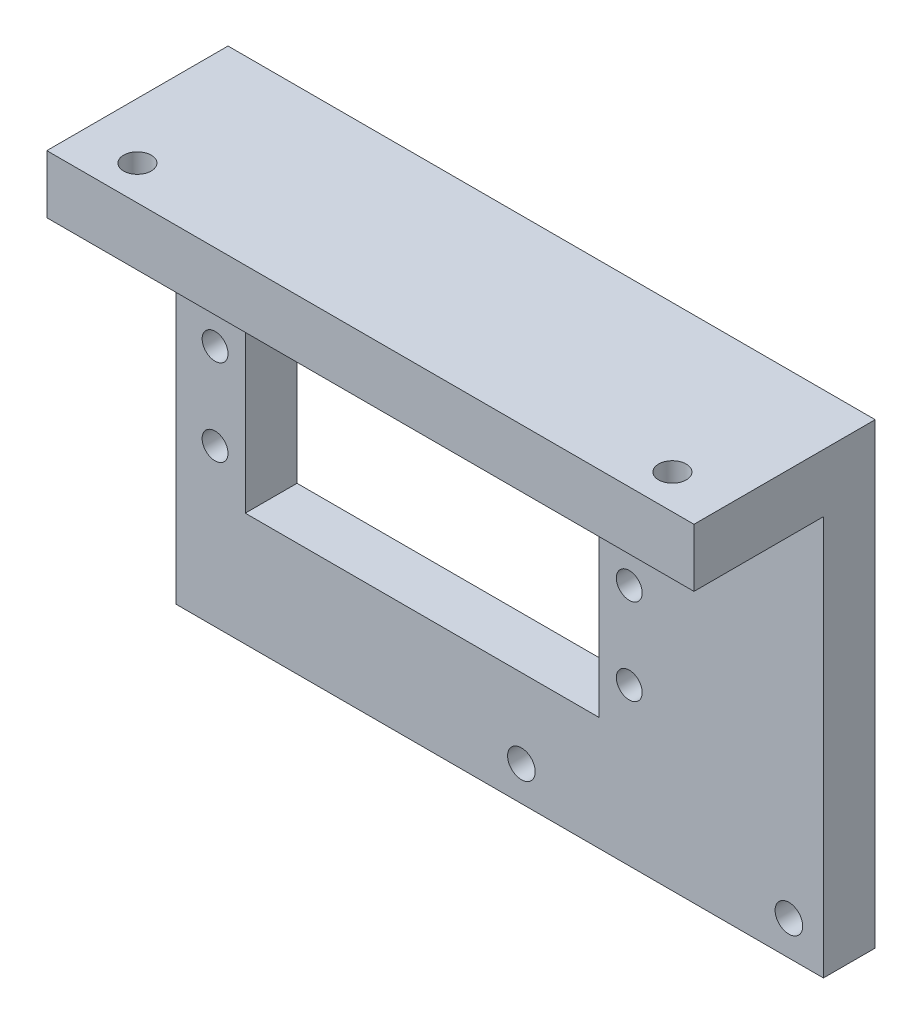
ISO-10303-21;
HEADER;
FILE_DESCRIPTION(('STEP AP214'),'2;1');
FILE_NAME('part.step','',(''),(''),'','','');
FILE_SCHEMA(('AUTOMOTIVE_DESIGN { 1 0 10303 214 1 1 1 1 }'));
ENDSEC;
DATA;
#1=APPLICATION_CONTEXT('core data for automotive mechanical design processes');
#2=APPLICATION_PROTOCOL_DEFINITION('international standard','automotive_design',2000,#1);
#3=PRODUCT_CONTEXT('',#1,'mechanical');
#4=PRODUCT('Part','Part','',(#3));
#5=PRODUCT_RELATED_PRODUCT_CATEGORY('part','',(#4));
#6=PRODUCT_DEFINITION_FORMATION('','',#4);
#7=PRODUCT_DEFINITION_CONTEXT('part definition',#1,'design');
#8=PRODUCT_DEFINITION('design','',#6,#7);
#9=PRODUCT_DEFINITION_SHAPE('','',#8);
#10=(LENGTH_UNIT() NAMED_UNIT(*) SI_UNIT(.MILLI.,.METRE.));
#11=(NAMED_UNIT(*) PLANE_ANGLE_UNIT() SI_UNIT($,.RADIAN.));
#12=(NAMED_UNIT(*) SI_UNIT($,.STERADIAN.) SOLID_ANGLE_UNIT());
#13=UNCERTAINTY_MEASURE_WITH_UNIT(LENGTH_MEASURE(1.E-05),#10,'distance_accuracy_value','');
#14=(GEOMETRIC_REPRESENTATION_CONTEXT(3) GLOBAL_UNCERTAINTY_ASSIGNED_CONTEXT((#13)) GLOBAL_UNIT_ASSIGNED_CONTEXT((#10,
#11,#12)) REPRESENTATION_CONTEXT('',''));
#15=CARTESIAN_POINT('',(0.,0.,0.));
#16=DIRECTION('',(0.,0.,1.));
#17=DIRECTION('',(1.,0.,0.));
#18=AXIS2_PLACEMENT_3D('',#15,#16,#17);
#19=CARTESIAN_POINT('',(-28.5,-23.15,-6.));
#20=DIRECTION('',(-1.,0.,0.));
#21=DIRECTION('',(0.,-1.,0.));
#22=AXIS2_PLACEMENT_3D('',#19,#20,#21);
#23=PLANE('',#22);
#24=DIRECTION('',(0.,0.,1.));
#25=VECTOR('',#24,1.);
#26=CARTESIAN_POINT('',(-28.5,29.8866,0.));
#27=LINE('',#26,#25);
#28=CARTESIAN_POINT('',(-28.5,29.8866,-6.00000000000003));
#29=VERTEX_POINT('',#28);
#30=CARTESIAN_POINT('',(-28.5,29.8866,15.));
#31=VERTEX_POINT('',#30);
#32=EDGE_CURVE('E203',#29,#31,#27,.T.);
#33=ORIENTED_EDGE('',*,*,#32,.F.);
#34=DIRECTION('',(0.,-1.,0.));
#35=VECTOR('',#34,1.);
#36=CARTESIAN_POINT('',(-28.5,-23.15,-6.));
#37=LINE('',#36,#35);
#38=CARTESIAN_POINT('',(-28.5,-23.15,-6.));
#39=VERTEX_POINT('',#38);
#40=EDGE_CURVE('E280',#29,#39,#37,.T.);
#41=ORIENTED_EDGE('',*,*,#40,.T.);
#42=DIRECTION('',(0.,0.,1.));
#43=VECTOR('',#42,1.);
#44=CARTESIAN_POINT('',(-28.5,-23.15,-6.));
#45=LINE('',#44,#43);
#46=CARTESIAN_POINT('',(-28.5,-23.15,0.));
#47=VERTEX_POINT('',#46);
#48=EDGE_CURVE('E72',#39,#47,#45,.T.);
#49=ORIENTED_EDGE('',*,*,#48,.T.);
#50=DIRECTION('',(0.,-1.,0.));
#51=VECTOR('',#50,1.);
#52=CARTESIAN_POINT('',(-28.5,-23.15,0.));
#53=LINE('',#52,#51);
#54=CARTESIAN_POINT('',(-28.5,23.15,0.));
#55=VERTEX_POINT('',#54);
#56=EDGE_CURVE('E162',#55,#47,#53,.T.);
#57=ORIENTED_EDGE('',*,*,#56,.F.);
#58=DIRECTION('',(0.,0.,1.));
#59=VECTOR('',#58,1.);
#60=CARTESIAN_POINT('',(-28.5,23.15,15.));
#61=LINE('',#60,#59);
#62=CARTESIAN_POINT('',(-28.5,23.15,15.));
#63=VERTEX_POINT('',#62);
#64=EDGE_CURVE('E160',#55,#63,#61,.T.);
#65=ORIENTED_EDGE('',*,*,#64,.T.);
#66=DIRECTION('',(0.,-1.,0.));
#67=VECTOR('',#66,1.);
#68=CARTESIAN_POINT('',(-28.5,29.8866,15.));
#69=LINE('',#68,#67);
#70=EDGE_CURVE('E146',#31,#63,#69,.T.);
#71=ORIENTED_EDGE('',*,*,#70,.F.);
#72=EDGE_LOOP('',(#33,#41,#49,#57,#65,#71));
#73=FACE_BOUND('',#72,.T.);
#74=ADVANCED_FACE('F69',(#73),#23,.T.);
#75=CARTESIAN_POINT('',(46.5,-23.15,-6.));
#76=DIRECTION('',(1.,0.,0.));
#77=DIRECTION('',(0.,1.,0.));
#78=AXIS2_PLACEMENT_3D('',#75,#76,#77);
#79=PLANE('',#78);
#80=DIRECTION('',(0.,1.,0.));
#81=VECTOR('',#80,1.);
#82=CARTESIAN_POINT('',(46.5,-23.15,-6.));
#83=LINE('',#82,#81);
#84=CARTESIAN_POINT('',(46.5,-23.15,-6.));
#85=VERTEX_POINT('',#84);
#86=CARTESIAN_POINT('',(46.5,29.8866,-6.00000000000003));
#87=VERTEX_POINT('',#86);
#88=EDGE_CURVE('E289',#85,#87,#83,.T.);
#89=ORIENTED_EDGE('',*,*,#88,.T.);
#90=DIRECTION('',(0.,0.,-1.));
#91=VECTOR('',#90,1.);
#92=CARTESIAN_POINT('',(46.5,29.8866,-1.22777156072897E-13));
#93=LINE('',#92,#91);
#94=CARTESIAN_POINT('',(46.5,29.8866000000001,15.));
#95=VERTEX_POINT('',#94);
#96=EDGE_CURVE('E194',#95,#87,#93,.T.);
#97=ORIENTED_EDGE('',*,*,#96,.F.);
#98=DIRECTION('',(0.,-1.,0.));
#99=VECTOR('',#98,1.);
#100=CARTESIAN_POINT('',(46.5,29.8866000000001,15.));
#101=LINE('',#100,#99);
#102=CARTESIAN_POINT('',(46.5,23.1500000000001,15.));
#103=VERTEX_POINT('',#102);
#104=EDGE_CURVE('E157',#95,#103,#101,.T.);
#105=ORIENTED_EDGE('',*,*,#104,.T.);
#106=DIRECTION('',(0.,0.,-1.));
#107=VECTOR('',#106,1.);
#108=CARTESIAN_POINT('',(46.5,23.1500000000001,15.));
#109=LINE('',#108,#107);
#110=CARTESIAN_POINT('',(46.5,23.15,0.));
#111=VERTEX_POINT('',#110);
#112=EDGE_CURVE('E166',#103,#111,#109,.T.);
#113=ORIENTED_EDGE('',*,*,#112,.T.);
#114=DIRECTION('',(0.,1.,0.));
#115=VECTOR('',#114,1.);
#116=CARTESIAN_POINT('',(46.5,-23.15,0.));
#117=LINE('',#116,#115);
#118=CARTESIAN_POINT('',(46.5,-23.15,0.));
#119=VERTEX_POINT('',#118);
#120=EDGE_CURVE('E298',#119,#111,#117,.T.);
#121=ORIENTED_EDGE('',*,*,#120,.F.);
#122=DIRECTION('',(0.,0.,1.));
#123=VECTOR('',#122,1.);
#124=CARTESIAN_POINT('',(46.5,-23.15,-6.));
#125=LINE('',#124,#123);
#126=EDGE_CURVE('E13',#85,#119,#125,.T.);
#127=ORIENTED_EDGE('',*,*,#126,.F.);
#128=EDGE_LOOP('',(#89,#97,#105,#113,#121,#127));
#129=FACE_BOUND('',#128,.T.);
#130=ADVANCED_FACE('F309',(#129),#79,.T.);
#131=CARTESIAN_POINT('',(-28.5,-23.15,-6.));
#132=DIRECTION('',(0.,-1.,0.));
#133=DIRECTION('',(1.,0.,0.));
#134=AXIS2_PLACEMENT_3D('',#131,#132,#133);
#135=PLANE('',#134);
#136=DIRECTION('',(1.,0.,0.));
#137=VECTOR('',#136,1.);
#138=CARTESIAN_POINT('',(-28.5,-23.15,0.));
#139=LINE('',#138,#137);
#140=EDGE_CURVE('E294',#47,#119,#139,.T.);
#141=ORIENTED_EDGE('',*,*,#140,.F.);
#142=ORIENTED_EDGE('',*,*,#48,.F.);
#143=DIRECTION('',(1.,0.,0.));
#144=VECTOR('',#143,1.);
#145=CARTESIAN_POINT('',(-28.5,-23.15,-6.));
#146=LINE('',#145,#144);
#147=EDGE_CURVE('E284',#39,#85,#146,.T.);
#148=ORIENTED_EDGE('',*,*,#147,.T.);
#149=ORIENTED_EDGE('',*,*,#126,.T.);
#150=EDGE_LOOP('',(#141,#142,#148,#149));
#151=FACE_BOUND('',#150,.T.);
#152=ADVANCED_FACE('F351',(#151),#135,.T.);
#153=CARTESIAN_POINT('',(0.,0.,-6.));
#154=DIRECTION('',(0.,0.,-1.));
#155=DIRECTION('',(-1.,0.,0.));
#156=AXIS2_PLACEMENT_3D('',#153,#154,#155);
#157=PLANE('',#156);
#158=CARTESIAN_POINT('',(42.5,-19.15,-6.));
#159=DIRECTION('',(0.,0.,-1.));
#160=DIRECTION('',(-1.,0.,0.));
#161=AXIS2_PLACEMENT_3D('',#158,#159,#160);
#162=CIRCLE('',#161,1.6);
#163=CARTESIAN_POINT('',(40.9,-19.15,-6.));
#164=VERTEX_POINT('',#163);
#165=EDGE_CURVE('E187',#164,#164,#162,.T.);
#166=ORIENTED_EDGE('',*,*,#165,.F.);
#167=EDGE_LOOP('',(#166));
#168=FACE_BOUND('',#167,.T.);
#169=CARTESIAN_POINT('',(11.5,-19.15,-6.));
#170=DIRECTION('',(0.,0.,-1.));
#171=DIRECTION('',(-1.,0.,0.));
#172=AXIS2_PLACEMENT_3D('',#169,#170,#171);
#173=CIRCLE('',#172,1.6);
#174=CARTESIAN_POINT('',(9.9,-19.15,-6.));
#175=VERTEX_POINT('',#174);
#176=EDGE_CURVE('E178',#175,#175,#173,.T.);
#177=ORIENTED_EDGE('',*,*,#176,.F.);
#178=EDGE_LOOP('',(#177));
#179=FACE_BOUND('',#178,.T.);
#180=CARTESIAN_POINT('',(-24.,-5.,-6.));
#181=DIRECTION('',(0.,0.,1.));
#182=DIRECTION('',(-1.,0.,0.));
#183=AXIS2_PLACEMENT_3D('',#180,#181,#182);
#184=CIRCLE('',#183,1.5);
#185=CARTESIAN_POINT('',(-25.5,-5.,-6.));
#186=VERTEX_POINT('',#185);
#187=EDGE_CURVE('E209',#186,#186,#184,.T.);
#188=ORIENTED_EDGE('',*,*,#187,.T.);
#189=EDGE_LOOP('',(#188));
#190=FACE_BOUND('',#189,.T.);
#191=CARTESIAN_POINT('',(24.,-5.,-6.));
#192=DIRECTION('',(0.,0.,1.));
#193=DIRECTION('',(1.,0.,0.));
#194=AXIS2_PLACEMENT_3D('',#191,#192,#193);
#195=CIRCLE('',#194,1.5);
#196=CARTESIAN_POINT('',(25.5,-5.,-6.));
#197=VERTEX_POINT('',#196);
#198=EDGE_CURVE('E217',#197,#197,#195,.T.);
#199=ORIENTED_EDGE('',*,*,#198,.T.);
#200=EDGE_LOOP('',(#199));
#201=FACE_BOUND('',#200,.T.);
#202=CARTESIAN_POINT('',(24.,5.,-6.));
#203=DIRECTION('',(0.,0.,1.));
#204=DIRECTION('',(-1.,0.,0.));
#205=AXIS2_PLACEMENT_3D('',#202,#203,#204);
#206=CIRCLE('',#205,1.5);
#207=CARTESIAN_POINT('',(22.5,5.,-6.));
#208=VERTEX_POINT('',#207);
#209=EDGE_CURVE('E225',#208,#208,#206,.T.);
#210=ORIENTED_EDGE('',*,*,#209,.T.);
#211=EDGE_LOOP('',(#210));
#212=FACE_BOUND('',#211,.T.);
#213=CARTESIAN_POINT('',(-24.,5.,-6.));
#214=DIRECTION('',(0.,0.,1.));
#215=DIRECTION('',(1.,0.,0.));
#216=AXIS2_PLACEMENT_3D('',#213,#214,#215);
#217=CIRCLE('',#216,1.5);
#218=CARTESIAN_POINT('',(-22.5,5.,-6.));
#219=VERTEX_POINT('',#218);
#220=EDGE_CURVE('E233',#219,#219,#217,.T.);
#221=ORIENTED_EDGE('',*,*,#220,.T.);
#222=EDGE_LOOP('',(#221));
#223=FACE_BOUND('',#222,.T.);
#224=DIRECTION('',(0.,1.,0.));
#225=VECTOR('',#224,1.);
#226=CARTESIAN_POINT('',(20.5,-10.,-6.));
#227=LINE('',#226,#225);
#228=CARTESIAN_POINT('',(20.5,-10.,-6.));
#229=VERTEX_POINT('',#228);
#230=CARTESIAN_POINT('',(20.5,9.99999999999999,-6.));
#231=VERTEX_POINT('',#230);
#232=EDGE_CURVE('E240',#229,#231,#227,.T.);
#233=ORIENTED_EDGE('',*,*,#232,.T.);
#234=DIRECTION('',(-1.,0.,0.));
#235=VECTOR('',#234,1.);
#236=CARTESIAN_POINT('',(-20.5,9.99999999999999,-6.));
#237=LINE('',#236,#235);
#238=CARTESIAN_POINT('',(-20.5,9.99999999999999,-6.));
#239=VERTEX_POINT('',#238);
#240=EDGE_CURVE('E244',#231,#239,#237,.T.);
#241=ORIENTED_EDGE('',*,*,#240,.T.);
#242=DIRECTION('',(0.,-1.,0.));
#243=VECTOR('',#242,1.);
#244=CARTESIAN_POINT('',(-20.5,-10.,-6.));
#245=LINE('',#244,#243);
#246=CARTESIAN_POINT('',(-20.5,-10.,-6.));
#247=VERTEX_POINT('',#246);
#248=EDGE_CURVE('E84',#239,#247,#245,.T.);
#249=ORIENTED_EDGE('',*,*,#248,.T.);
#250=DIRECTION('',(1.,0.,0.));
#251=VECTOR('',#250,1.);
#252=CARTESIAN_POINT('',(-20.5,-10.,-6.));
#253=LINE('',#252,#251);
#254=EDGE_CURVE('E251',#247,#229,#253,.T.);
#255=ORIENTED_EDGE('',*,*,#254,.T.);
#256=EDGE_LOOP('',(#233,#241,#249,#255));
#257=FACE_BOUND('',#256,.T.);
#258=ORIENTED_EDGE('',*,*,#40,.F.);
#259=DIRECTION('',(-1.,0.,0.));
#260=VECTOR('',#259,1.);
#261=CARTESIAN_POINT('',(46.5,29.8866,-6.00000000000003));
#262=LINE('',#261,#260);
#263=EDGE_CURVE('E182',#87,#29,#262,.T.);
#264=ORIENTED_EDGE('',*,*,#263,.F.);
#265=ORIENTED_EDGE('',*,*,#88,.F.);
#266=ORIENTED_EDGE('',*,*,#147,.F.);
#267=EDGE_LOOP('',(#258,#264,#265,#266));
#268=FACE_BOUND('',#267,.T.);
#269=ADVANCED_FACE('F346',(#168,#179,#190,#201,#212,#223,#257,#268),#157,.T.);
#270=CARTESIAN_POINT('',(0.,0.,0.));
#271=DIRECTION('',(0.,0.,-1.));
#272=DIRECTION('',(-1.,0.,0.));
#273=AXIS2_PLACEMENT_3D('',#270,#271,#272);
#274=PLANE('',#273);
#275=CARTESIAN_POINT('',(42.5,-19.15,0.));
#276=DIRECTION('',(0.,0.,-1.));
#277=DIRECTION('',(-1.,0.,0.));
#278=AXIS2_PLACEMENT_3D('',#275,#276,#277);
#279=CIRCLE('',#278,1.6);
#280=CARTESIAN_POINT('',(40.9,-19.15,0.));
#281=VERTEX_POINT('',#280);
#282=EDGE_CURVE('E191',#281,#281,#279,.F.);
#283=ORIENTED_EDGE('',*,*,#282,.F.);
#284=EDGE_LOOP('',(#283));
#285=FACE_BOUND('',#284,.T.);
#286=CARTESIAN_POINT('',(11.5,-19.15,0.));
#287=DIRECTION('',(0.,0.,-1.));
#288=DIRECTION('',(-1.,0.,0.));
#289=AXIS2_PLACEMENT_3D('',#286,#287,#288);
#290=CIRCLE('',#289,1.6);
#291=CARTESIAN_POINT('',(9.9,-19.15,0.));
#292=VERTEX_POINT('',#291);
#293=EDGE_CURVE('E172',#292,#292,#290,.F.);
#294=ORIENTED_EDGE('',*,*,#293,.F.);
#295=EDGE_LOOP('',(#294));
#296=FACE_BOUND('',#295,.T.);
#297=CARTESIAN_POINT('',(-24.,-5.,0.));
#298=DIRECTION('',(0.,0.,1.));
#299=DIRECTION('',(-1.,0.,0.));
#300=AXIS2_PLACEMENT_3D('',#297,#298,#299);
#301=CIRCLE('',#300,1.5);
#302=CARTESIAN_POINT('',(-25.5,-5.,0.));
#303=VERTEX_POINT('',#302);
#304=EDGE_CURVE('E156',#303,#303,#301,.T.);
#305=ORIENTED_EDGE('',*,*,#304,.F.);
#306=EDGE_LOOP('',(#305));
#307=FACE_BOUND('',#306,.T.);
#308=CARTESIAN_POINT('',(24.,-5.,0.));
#309=DIRECTION('',(0.,0.,1.));
#310=DIRECTION('',(1.,0.,0.));
#311=AXIS2_PLACEMENT_3D('',#308,#309,#310);
#312=CIRCLE('',#311,1.5);
#313=CARTESIAN_POINT('',(25.5,-5.,0.));
#314=VERTEX_POINT('',#313);
#315=EDGE_CURVE('E213',#314,#314,#312,.T.);
#316=ORIENTED_EDGE('',*,*,#315,.F.);
#317=EDGE_LOOP('',(#316));
#318=FACE_BOUND('',#317,.T.);
#319=CARTESIAN_POINT('',(24.,5.,0.));
#320=DIRECTION('',(0.,0.,1.));
#321=DIRECTION('',(-1.,0.,0.));
#322=AXIS2_PLACEMENT_3D('',#319,#320,#321);
#323=CIRCLE('',#322,1.5);
#324=CARTESIAN_POINT('',(22.5,5.,0.));
#325=VERTEX_POINT('',#324);
#326=EDGE_CURVE('E221',#325,#325,#323,.T.);
#327=ORIENTED_EDGE('',*,*,#326,.F.);
#328=EDGE_LOOP('',(#327));
#329=FACE_BOUND('',#328,.T.);
#330=CARTESIAN_POINT('',(-24.,5.,0.));
#331=DIRECTION('',(0.,0.,1.));
#332=DIRECTION('',(1.,0.,0.));
#333=AXIS2_PLACEMENT_3D('',#330,#331,#332);
#334=CIRCLE('',#333,1.5);
#335=CARTESIAN_POINT('',(-22.5,5.,0.));
#336=VERTEX_POINT('',#335);
#337=EDGE_CURVE('E229',#336,#336,#334,.T.);
#338=ORIENTED_EDGE('',*,*,#337,.F.);
#339=EDGE_LOOP('',(#338));
#340=FACE_BOUND('',#339,.T.);
#341=DIRECTION('',(-1.,0.,0.));
#342=VECTOR('',#341,1.);
#343=CARTESIAN_POINT('',(-20.5,9.99999999999999,0.));
#344=LINE('',#343,#342);
#345=CARTESIAN_POINT('',(20.5,9.99999999999999,0.));
#346=VERTEX_POINT('',#345);
#347=CARTESIAN_POINT('',(-20.5,9.99999999999999,0.));
#348=VERTEX_POINT('',#347);
#349=EDGE_CURVE('E258',#346,#348,#344,.T.);
#350=ORIENTED_EDGE('',*,*,#349,.F.);
#351=DIRECTION('',(0.,1.,0.));
#352=VECTOR('',#351,1.);
#353=CARTESIAN_POINT('',(20.5,-10.,0.));
#354=LINE('',#353,#352);
#355=CARTESIAN_POINT('',(20.5,-10.,0.));
#356=VERTEX_POINT('',#355);
#357=EDGE_CURVE('E92',#356,#346,#354,.T.);
#358=ORIENTED_EDGE('',*,*,#357,.F.);
#359=DIRECTION('',(1.,0.,0.));
#360=VECTOR('',#359,1.);
#361=CARTESIAN_POINT('',(-20.5,-10.,0.));
#362=LINE('',#361,#360);
#363=CARTESIAN_POINT('',(-20.5,-10.,0.));
#364=VERTEX_POINT('',#363);
#365=EDGE_CURVE('E245',#364,#356,#362,.T.);
#366=ORIENTED_EDGE('',*,*,#365,.F.);
#367=DIRECTION('',(0.,-1.,0.));
#368=VECTOR('',#367,1.);
#369=CARTESIAN_POINT('',(-20.5,-10.,0.));
#370=LINE('',#369,#368);
#371=EDGE_CURVE('E262',#348,#364,#370,.T.);
#372=ORIENTED_EDGE('',*,*,#371,.F.);
#373=EDGE_LOOP('',(#350,#358,#366,#372));
#374=FACE_BOUND('',#373,.T.);
#375=ORIENTED_EDGE('',*,*,#56,.T.);
#376=ORIENTED_EDGE('',*,*,#140,.T.);
#377=ORIENTED_EDGE('',*,*,#120,.T.);
#378=DIRECTION('',(-1.,0.,0.));
#379=VECTOR('',#378,1.);
#380=CARTESIAN_POINT('',(-28.5,23.15,0.));
#381=LINE('',#380,#379);
#382=EDGE_CURVE('E285',#111,#55,#381,.T.);
#383=ORIENTED_EDGE('',*,*,#382,.T.);
#384=EDGE_LOOP('',(#375,#376,#377,#383));
#385=FACE_BOUND('',#384,.T.);
#386=ADVANCED_FACE('F306',(#285,#296,#307,#318,#329,#340,#374,#385),#274,.F.);
#387=CARTESIAN_POINT('',(20.5,-10.,-6.));
#388=DIRECTION('',(1.,0.,0.));
#389=DIRECTION('',(0.,0.,-1.));
#390=AXIS2_PLACEMENT_3D('',#387,#388,#389);
#391=PLANE('',#390);
#392=ORIENTED_EDGE('',*,*,#357,.T.);
#393=DIRECTION('',(0.,0.,1.));
#394=VECTOR('',#393,1.);
#395=CARTESIAN_POINT('',(20.5,9.99999999999999,-6.));
#396=LINE('',#395,#394);
#397=EDGE_CURVE('E255',#231,#346,#396,.T.);
#398=ORIENTED_EDGE('',*,*,#397,.F.);
#399=ORIENTED_EDGE('',*,*,#232,.F.);
#400=DIRECTION('',(0.,0.,1.));
#401=VECTOR('',#400,1.);
#402=CARTESIAN_POINT('',(20.5,-10.,-6.));
#403=LINE('',#402,#401);
#404=EDGE_CURVE('E269',#229,#356,#403,.T.);
#405=ORIENTED_EDGE('',*,*,#404,.T.);
#406=EDGE_LOOP('',(#392,#398,#399,#405));
#407=FACE_BOUND('',#406,.T.);
#408=ADVANCED_FACE('F386',(#407),#391,.F.);
#409=CARTESIAN_POINT('',(-20.5,-10.,-6.));
#410=DIRECTION('',(0.,-1.,0.));
#411=DIRECTION('',(0.,0.,-1.));
#412=AXIS2_PLACEMENT_3D('',#409,#410,#411);
#413=PLANE('',#412);
#414=ORIENTED_EDGE('',*,*,#365,.T.);
#415=ORIENTED_EDGE('',*,*,#404,.F.);
#416=ORIENTED_EDGE('',*,*,#254,.F.);
#417=DIRECTION('',(0.,0.,1.));
#418=VECTOR('',#417,1.);
#419=CARTESIAN_POINT('',(-20.5,-10.,-6.));
#420=LINE('',#419,#418);
#421=EDGE_CURVE('E272',#247,#364,#420,.T.);
#422=ORIENTED_EDGE('',*,*,#421,.T.);
#423=EDGE_LOOP('',(#414,#415,#416,#422));
#424=FACE_BOUND('',#423,.T.);
#425=ADVANCED_FACE('F549',(#424),#413,.F.);
#426=CARTESIAN_POINT('',(-20.5,-10.,-6.));
#427=DIRECTION('',(-1.,0.,0.));
#428=DIRECTION('',(0.,0.,1.));
#429=AXIS2_PLACEMENT_3D('',#426,#427,#428);
#430=PLANE('',#429);
#431=ORIENTED_EDGE('',*,*,#371,.T.);
#432=ORIENTED_EDGE('',*,*,#421,.F.);
#433=ORIENTED_EDGE('',*,*,#248,.F.);
#434=DIRECTION('',(0.,0.,1.));
#435=VECTOR('',#434,1.);
#436=CARTESIAN_POINT('',(-20.5,9.99999999999999,-6.));
#437=LINE('',#436,#435);
#438=EDGE_CURVE('E275',#239,#348,#437,.T.);
#439=ORIENTED_EDGE('',*,*,#438,.T.);
#440=EDGE_LOOP('',(#431,#432,#433,#439));
#441=FACE_BOUND('',#440,.T.);
#442=ADVANCED_FACE('F537',(#441),#430,.F.);
#443=CARTESIAN_POINT('',(-20.5,9.99999999999999,-6.));
#444=DIRECTION('',(0.,1.,0.));
#445=DIRECTION('',(0.,0.,1.));
#446=AXIS2_PLACEMENT_3D('',#443,#444,#445);
#447=PLANE('',#446);
#448=ORIENTED_EDGE('',*,*,#349,.T.);
#449=ORIENTED_EDGE('',*,*,#438,.F.);
#450=ORIENTED_EDGE('',*,*,#240,.F.);
#451=ORIENTED_EDGE('',*,*,#397,.T.);
#452=EDGE_LOOP('',(#448,#449,#450,#451));
#453=FACE_BOUND('',#452,.T.);
#454=ADVANCED_FACE('F525',(#453),#447,.F.);
#455=CARTESIAN_POINT('',(-24.,5.,-6.));
#456=DIRECTION('',(0.,0.,1.));
#457=DIRECTION('',(1.,0.,0.));
#458=AXIS2_PLACEMENT_3D('',#455,#456,#457);
#459=CYLINDRICAL_SURFACE('',#458,1.5);
#460=ORIENTED_EDGE('',*,*,#220,.F.);
#461=EDGE_LOOP('',(#460));
#462=FACE_BOUND('',#461,.T.);
#463=ORIENTED_EDGE('',*,*,#337,.T.);
#464=EDGE_LOOP('',(#463));
#465=FACE_BOUND('',#464,.T.);
#466=ADVANCED_FACE('F513',(#462,#465),#459,.F.);
#467=CARTESIAN_POINT('',(24.,5.,-6.));
#468=DIRECTION('',(0.,0.,1.));
#469=DIRECTION('',(1.,0.,0.));
#470=AXIS2_PLACEMENT_3D('',#467,#468,#469);
#471=CYLINDRICAL_SURFACE('',#470,1.5);
#472=ORIENTED_EDGE('',*,*,#209,.F.);
#473=EDGE_LOOP('',(#472));
#474=FACE_BOUND('',#473,.T.);
#475=ORIENTED_EDGE('',*,*,#326,.T.);
#476=EDGE_LOOP('',(#475));
#477=FACE_BOUND('',#476,.T.);
#478=ADVANCED_FACE('F501',(#474,#477),#471,.F.);
#479=CARTESIAN_POINT('',(24.,-5.,-6.));
#480=DIRECTION('',(0.,0.,1.));
#481=DIRECTION('',(1.,0.,0.));
#482=AXIS2_PLACEMENT_3D('',#479,#480,#481);
#483=CYLINDRICAL_SURFACE('',#482,1.5);
#484=ORIENTED_EDGE('',*,*,#198,.F.);
#485=EDGE_LOOP('',(#484));
#486=FACE_BOUND('',#485,.T.);
#487=ORIENTED_EDGE('',*,*,#315,.T.);
#488=EDGE_LOOP('',(#487));
#489=FACE_BOUND('',#488,.T.);
#490=ADVANCED_FACE('F489',(#486,#489),#483,.F.);
#491=CARTESIAN_POINT('',(-24.,-5.,-6.));
#492=DIRECTION('',(0.,0.,1.));
#493=DIRECTION('',(1.,0.,0.));
#494=AXIS2_PLACEMENT_3D('',#491,#492,#493);
#495=CYLINDRICAL_SURFACE('',#494,1.5);
#496=ORIENTED_EDGE('',*,*,#187,.F.);
#497=EDGE_LOOP('',(#496));
#498=FACE_BOUND('',#497,.T.);
#499=ORIENTED_EDGE('',*,*,#304,.T.);
#500=EDGE_LOOP('',(#499));
#501=FACE_BOUND('',#500,.T.);
#502=ADVANCED_FACE('F339',(#498,#501),#495,.F.);
#503=CARTESIAN_POINT('',(0.,29.8866,-1.01266584970785E-13));
#504=DIRECTION('',(0.,-1.,0.));
#505=DIRECTION('',(0.,0.,-1.));
#506=AXIS2_PLACEMENT_3D('',#503,#504,#505);
#507=PLANE('',#506);
#508=CARTESIAN_POINT('',(-22.,29.8866,11.));
#509=DIRECTION('',(0.,1.,0.));
#510=DIRECTION('',(0.,0.,1.));
#511=AXIS2_PLACEMENT_3D('',#508,#509,#510);
#512=CIRCLE('',#511,1.6);
#513=CARTESIAN_POINT('',(-22.,29.8866,12.6));
#514=VERTEX_POINT('',#513);
#515=EDGE_CURVE('E319',#514,#514,#512,.T.);
#516=ORIENTED_EDGE('',*,*,#515,.F.);
#517=EDGE_LOOP('',(#516));
#518=FACE_BOUND('',#517,.T.);
#519=CARTESIAN_POINT('',(40.,29.8866,11.));
#520=DIRECTION('',(0.,1.,0.));
#521=DIRECTION('',(0.,0.,-1.));
#522=AXIS2_PLACEMENT_3D('',#519,#520,#521);
#523=CIRCLE('',#522,1.6);
#524=CARTESIAN_POINT('',(40.,29.8866,9.39999999999998));
#525=VERTEX_POINT('',#524);
#526=EDGE_CURVE('E315',#525,#525,#523,.T.);
#527=ORIENTED_EDGE('',*,*,#526,.F.);
#528=EDGE_LOOP('',(#527));
#529=FACE_BOUND('',#528,.T.);
#530=ORIENTED_EDGE('',*,*,#96,.T.);
#531=ORIENTED_EDGE('',*,*,#263,.T.);
#532=ORIENTED_EDGE('',*,*,#32,.T.);
#533=DIRECTION('',(1.,0.,0.));
#534=VECTOR('',#533,1.);
#535=CARTESIAN_POINT('',(0.,29.8866000000001,15.));
#536=LINE('',#535,#534);
#537=EDGE_CURVE('E152',#31,#95,#536,.T.);
#538=ORIENTED_EDGE('',*,*,#537,.T.);
#539=EDGE_LOOP('',(#530,#531,#532,#538));
#540=FACE_BOUND('',#539,.T.);
#541=ADVANCED_FACE('F336',(#518,#529,#540),#507,.F.);
#542=CARTESIAN_POINT('',(46.5,29.8866000000001,15.));
#543=DIRECTION('',(0.,0.,-1.));
#544=DIRECTION('',(0.,1.,0.));
#545=AXIS2_PLACEMENT_3D('',#542,#543,#544);
#546=PLANE('',#545);
#547=ORIENTED_EDGE('',*,*,#70,.T.);
#548=DIRECTION('',(1.,0.,0.));
#549=VECTOR('',#548,1.);
#550=CARTESIAN_POINT('',(46.5,23.1500000000001,15.));
#551=LINE('',#550,#549);
#552=EDGE_CURVE('E151',#63,#103,#551,.T.);
#553=ORIENTED_EDGE('',*,*,#552,.T.);
#554=ORIENTED_EDGE('',*,*,#104,.F.);
#555=ORIENTED_EDGE('',*,*,#537,.F.);
#556=EDGE_LOOP('',(#547,#553,#554,#555));
#557=FACE_BOUND('',#556,.T.);
#558=ADVANCED_FACE('F148',(#557),#546,.F.);
#559=CARTESIAN_POINT('',(11.5,-19.15,15.001));
#560=DIRECTION('',(0.,0.,-1.));
#561=DIRECTION('',(-1.,0.,0.));
#562=AXIS2_PLACEMENT_3D('',#559,#560,#561);
#563=CYLINDRICAL_SURFACE('',#562,1.6);
#564=CARTESIAN_POINT('',(9.9,-19.15,-6.));
#565=CARTESIAN_POINT('',(9.9,-19.15,-5.9375));
#566=CARTESIAN_POINT('',(9.9,-19.15,-5.875));
#567=CARTESIAN_POINT('',(9.9,-19.15,-5.75));
#568=CARTESIAN_POINT('',(9.9,-19.15,-5.6875));
#569=CARTESIAN_POINT('',(9.9,-19.15,-5.5625));
#570=CARTESIAN_POINT('',(9.9,-19.15,-5.5));
#571=CARTESIAN_POINT('',(9.9,-19.15,-5.375));
#572=CARTESIAN_POINT('',(9.9,-19.15,-5.3125));
#573=CARTESIAN_POINT('',(9.9,-19.15,-5.1875));
#574=CARTESIAN_POINT('',(9.9,-19.15,-5.125));
#575=CARTESIAN_POINT('',(9.9,-19.15,-5.));
#576=CARTESIAN_POINT('',(9.9,-19.15,-4.9375));
#577=CARTESIAN_POINT('',(9.9,-19.15,-4.8125));
#578=CARTESIAN_POINT('',(9.9,-19.15,-4.75));
#579=CARTESIAN_POINT('',(9.9,-19.15,-4.625));
#580=CARTESIAN_POINT('',(9.9,-19.15,-4.5625));
#581=CARTESIAN_POINT('',(9.9,-19.15,-4.4375));
#582=CARTESIAN_POINT('',(9.9,-19.15,-4.375));
#583=CARTESIAN_POINT('',(9.9,-19.15,-4.25));
#584=CARTESIAN_POINT('',(9.9,-19.15,-4.1875));
#585=CARTESIAN_POINT('',(9.9,-19.15,-4.0625));
#586=CARTESIAN_POINT('',(9.9,-19.15,-4.));
#587=CARTESIAN_POINT('',(9.9,-19.15,-3.875));
#588=CARTESIAN_POINT('',(9.9,-19.15,-3.8125));
#589=CARTESIAN_POINT('',(9.9,-19.15,-3.6875));
#590=CARTESIAN_POINT('',(9.9,-19.15,-3.625));
#591=CARTESIAN_POINT('',(9.9,-19.15,-3.5));
#592=CARTESIAN_POINT('',(9.9,-19.15,-3.4375));
#593=CARTESIAN_POINT('',(9.9,-19.15,-3.3125));
#594=CARTESIAN_POINT('',(9.9,-19.15,-3.25));
#595=CARTESIAN_POINT('',(9.9,-19.15,-3.125));
#596=CARTESIAN_POINT('',(9.9,-19.15,-3.0625));
#597=CARTESIAN_POINT('',(9.9,-19.15,-2.9375));
#598=CARTESIAN_POINT('',(9.9,-19.15,-2.875));
#599=CARTESIAN_POINT('',(9.9,-19.15,-2.75));
#600=CARTESIAN_POINT('',(9.9,-19.15,-2.6875));
#601=CARTESIAN_POINT('',(9.9,-19.15,-2.5625));
#602=CARTESIAN_POINT('',(9.9,-19.15,-2.5));
#603=CARTESIAN_POINT('',(9.9,-19.15,-2.375));
#604=CARTESIAN_POINT('',(9.9,-19.15,-2.3125));
#605=CARTESIAN_POINT('',(9.9,-19.15,-2.1875));
#606=CARTESIAN_POINT('',(9.9,-19.15,-2.125));
#607=CARTESIAN_POINT('',(9.9,-19.15,-2.));
#608=CARTESIAN_POINT('',(9.9,-19.15,-1.9375));
#609=CARTESIAN_POINT('',(9.9,-19.15,-1.8125));
#610=CARTESIAN_POINT('',(9.9,-19.15,-1.75));
#611=CARTESIAN_POINT('',(9.9,-19.15,-1.625));
#612=CARTESIAN_POINT('',(9.9,-19.15,-1.5625));
#613=CARTESIAN_POINT('',(9.9,-19.15,-1.4375));
#614=CARTESIAN_POINT('',(9.9,-19.15,-1.375));
#615=CARTESIAN_POINT('',(9.9,-19.15,-1.25));
#616=CARTESIAN_POINT('',(9.9,-19.15,-1.1875));
#617=CARTESIAN_POINT('',(9.9,-19.15,-1.0625));
#618=CARTESIAN_POINT('',(9.9,-19.15,-0.999999999999999));
#619=CARTESIAN_POINT('',(9.9,-19.15,-0.874999999999999));
#620=CARTESIAN_POINT('',(9.9,-19.15,-0.812499999999999));
#621=CARTESIAN_POINT('',(9.9,-19.15,-0.687499999999999));
#622=CARTESIAN_POINT('',(9.9,-19.15,-0.625));
#623=CARTESIAN_POINT('',(9.9,-19.15,-0.5));
#624=CARTESIAN_POINT('',(9.9,-19.15,-0.4375));
#625=CARTESIAN_POINT('',(9.9,-19.15,-0.3125));
#626=CARTESIAN_POINT('',(9.9,-19.15,-0.25));
#627=CARTESIAN_POINT('',(9.9,-19.15,-0.125));
#628=CARTESIAN_POINT('',(9.9,-19.15,-0.0625000000000001));
#629=CARTESIAN_POINT('',(9.9,-19.15,0.));
#630=B_SPLINE_CURVE_WITH_KNOTS('',3,(#564,#565,#566,#567,#568,#569,#570,#571,#572,#573,#574,
#575,#576,#577,#578,#579,#580,#581,#582,#583,#584,#585,#586,#587,#588,#589,#590,#591,#592,#593,
#594,#595,#596,#597,#598,#599,#600,#601,#602,#603,#604,#605,#606,#607,#608,#609,#610,#611,#612,
#613,#614,#615,#616,#617,#618,#619,#620,#621,#622,#623,#624,#625,#626,#627,#628,#629),
.UNSPECIFIED.,.F.,.F.,(4,2,2,2,2,2,2,2,2,2,2,2,2,2,2,2,2,2,2,2,2,2,2,2,2,2,2,2,2,2,2,2,4),(0.,
0.1875,0.375,0.5625,0.750000000000001,0.937500000000001,1.125,1.3125,1.5,1.6875,1.875,2.0625,
2.25,2.4375,2.625,2.8125,3.,3.1875,3.375,3.5625,3.75,3.9375,4.125,4.3125,4.5,4.6875,4.875,
5.0625,5.25,5.4375,5.625,5.8125,6.),.UNSPECIFIED.);
#631=EDGE_CURVE('BSEAM399',#175,#292,#630,.T.);
#632=ORIENTED_EDGE('',*,*,#176,.T.);
#633=ORIENTED_EDGE('',*,*,#293,.T.);
#634=ORIENTED_EDGE('',*,*,#631,.T.);
#635=ORIENTED_EDGE('',*,*,#631,.F.);
#636=EDGE_LOOP('',(#632,#634,#633,#635));
#637=FACE_BOUND('',#636,.T.);
#638=ADVANCED_FACE('F399',(#637),#563,.F.);
#639=CARTESIAN_POINT('',(42.5,-19.15,15.001));
#640=DIRECTION('',(0.,0.,-1.));
#641=DIRECTION('',(-1.,0.,0.));
#642=AXIS2_PLACEMENT_3D('',#639,#640,#641);
#643=CYLINDRICAL_SURFACE('',#642,1.6);
#644=CARTESIAN_POINT('',(40.9,-19.15,-6.));
#645=CARTESIAN_POINT('',(40.9,-19.15,-5.9375));
#646=CARTESIAN_POINT('',(40.9,-19.15,-5.875));
#647=CARTESIAN_POINT('',(40.9,-19.15,-5.75));
#648=CARTESIAN_POINT('',(40.9,-19.15,-5.6875));
#649=CARTESIAN_POINT('',(40.9,-19.15,-5.5625));
#650=CARTESIAN_POINT('',(40.9,-19.15,-5.5));
#651=CARTESIAN_POINT('',(40.9,-19.15,-5.375));
#652=CARTESIAN_POINT('',(40.9,-19.15,-5.3125));
#653=CARTESIAN_POINT('',(40.9,-19.15,-5.1875));
#654=CARTESIAN_POINT('',(40.9,-19.15,-5.125));
#655=CARTESIAN_POINT('',(40.9,-19.15,-5.));
#656=CARTESIAN_POINT('',(40.9,-19.15,-4.9375));
#657=CARTESIAN_POINT('',(40.9,-19.15,-4.8125));
#658=CARTESIAN_POINT('',(40.9,-19.15,-4.75));
#659=CARTESIAN_POINT('',(40.9,-19.15,-4.625));
#660=CARTESIAN_POINT('',(40.9,-19.15,-4.5625));
#661=CARTESIAN_POINT('',(40.9,-19.15,-4.4375));
#662=CARTESIAN_POINT('',(40.9,-19.15,-4.375));
#663=CARTESIAN_POINT('',(40.9,-19.15,-4.25));
#664=CARTESIAN_POINT('',(40.9,-19.15,-4.1875));
#665=CARTESIAN_POINT('',(40.9,-19.15,-4.0625));
#666=CARTESIAN_POINT('',(40.9,-19.15,-4.));
#667=CARTESIAN_POINT('',(40.9,-19.15,-3.875));
#668=CARTESIAN_POINT('',(40.9,-19.15,-3.8125));
#669=CARTESIAN_POINT('',(40.9,-19.15,-3.6875));
#670=CARTESIAN_POINT('',(40.9,-19.15,-3.625));
#671=CARTESIAN_POINT('',(40.9,-19.15,-3.5));
#672=CARTESIAN_POINT('',(40.9,-19.15,-3.4375));
#673=CARTESIAN_POINT('',(40.9,-19.15,-3.3125));
#674=CARTESIAN_POINT('',(40.9,-19.15,-3.25));
#675=CARTESIAN_POINT('',(40.9,-19.15,-3.125));
#676=CARTESIAN_POINT('',(40.9,-19.15,-3.0625));
#677=CARTESIAN_POINT('',(40.9,-19.15,-2.9375));
#678=CARTESIAN_POINT('',(40.9,-19.15,-2.875));
#679=CARTESIAN_POINT('',(40.9,-19.15,-2.75));
#680=CARTESIAN_POINT('',(40.9,-19.15,-2.6875));
#681=CARTESIAN_POINT('',(40.9,-19.15,-2.5625));
#682=CARTESIAN_POINT('',(40.9,-19.15,-2.5));
#683=CARTESIAN_POINT('',(40.9,-19.15,-2.375));
#684=CARTESIAN_POINT('',(40.9,-19.15,-2.3125));
#685=CARTESIAN_POINT('',(40.9,-19.15,-2.1875));
#686=CARTESIAN_POINT('',(40.9,-19.15,-2.125));
#687=CARTESIAN_POINT('',(40.9,-19.15,-2.));
#688=CARTESIAN_POINT('',(40.9,-19.15,-1.9375));
#689=CARTESIAN_POINT('',(40.9,-19.15,-1.8125));
#690=CARTESIAN_POINT('',(40.9,-19.15,-1.75));
#691=CARTESIAN_POINT('',(40.9,-19.15,-1.625));
#692=CARTESIAN_POINT('',(40.9,-19.15,-1.5625));
#693=CARTESIAN_POINT('',(40.9,-19.15,-1.4375));
#694=CARTESIAN_POINT('',(40.9,-19.15,-1.375));
#695=CARTESIAN_POINT('',(40.9,-19.15,-1.25));
#696=CARTESIAN_POINT('',(40.9,-19.15,-1.1875));
#697=CARTESIAN_POINT('',(40.9,-19.15,-1.0625));
#698=CARTESIAN_POINT('',(40.9,-19.15,-0.999999999999999));
#699=CARTESIAN_POINT('',(40.9,-19.15,-0.874999999999999));
#700=CARTESIAN_POINT('',(40.9,-19.15,-0.812499999999999));
#701=CARTESIAN_POINT('',(40.9,-19.15,-0.687499999999999));
#702=CARTESIAN_POINT('',(40.9,-19.15,-0.625));
#703=CARTESIAN_POINT('',(40.9,-19.15,-0.5));
#704=CARTESIAN_POINT('',(40.9,-19.15,-0.4375));
#705=CARTESIAN_POINT('',(40.9,-19.15,-0.3125));
#706=CARTESIAN_POINT('',(40.9,-19.15,-0.25));
#707=CARTESIAN_POINT('',(40.9,-19.15,-0.125));
#708=CARTESIAN_POINT('',(40.9,-19.15,-0.0625000000000001));
#709=CARTESIAN_POINT('',(40.9,-19.15,0.));
#710=B_SPLINE_CURVE_WITH_KNOTS('',3,(#644,#645,#646,#647,#648,#649,#650,#651,#652,#653,#654,
#655,#656,#657,#658,#659,#660,#661,#662,#663,#664,#665,#666,#667,#668,#669,#670,#671,#672,#673,
#674,#675,#676,#677,#678,#679,#680,#681,#682,#683,#684,#685,#686,#687,#688,#689,#690,#691,#692,
#693,#694,#695,#696,#697,#698,#699,#700,#701,#702,#703,#704,#705,#706,#707,#708,#709),
.UNSPECIFIED.,.F.,.F.,(4,2,2,2,2,2,2,2,2,2,2,2,2,2,2,2,2,2,2,2,2,2,2,2,2,2,2,2,2,2,2,2,4),(0.,
0.1875,0.375,0.5625,0.750000000000001,0.937500000000001,1.125,1.3125,1.5,1.6875,1.875,2.0625,
2.25,2.4375,2.625,2.8125,3.,3.1875,3.375,3.5625,3.75,3.9375,4.125,4.3125,4.5,4.6875,4.875,
5.0625,5.25,5.4375,5.625,5.8125,6.),.UNSPECIFIED.);
#711=EDGE_CURVE('BSEAM418',#164,#281,#710,.T.);
#712=ORIENTED_EDGE('',*,*,#165,.T.);
#713=ORIENTED_EDGE('',*,*,#282,.T.);
#714=ORIENTED_EDGE('',*,*,#711,.T.);
#715=ORIENTED_EDGE('',*,*,#711,.F.);
#716=EDGE_LOOP('',(#712,#714,#713,#715));
#717=FACE_BOUND('',#716,.T.);
#718=ADVANCED_FACE('F418',(#717),#643,.F.);
#719=CARTESIAN_POINT('',(0.,23.15,0.));
#720=DIRECTION('',(0.,1.,0.));
#721=DIRECTION('',(0.,0.,1.));
#722=AXIS2_PLACEMENT_3D('',#719,#720,#721);
#723=PLANE('',#722);
#724=CARTESIAN_POINT('',(-22.,23.15,11.));
#725=DIRECTION('',(0.,1.,0.));
#726=DIRECTION('',(0.,0.,1.));
#727=AXIS2_PLACEMENT_3D('',#724,#725,#726);
#728=CIRCLE('',#727,1.6);
#729=CARTESIAN_POINT('',(-22.,23.15,12.6));
#730=VERTEX_POINT('',#729);
#731=EDGE_CURVE('E186',#730,#730,#728,.F.);
#732=ORIENTED_EDGE('',*,*,#731,.F.);
#733=EDGE_LOOP('',(#732));
#734=FACE_BOUND('',#733,.T.);
#735=CARTESIAN_POINT('',(40.,23.15,11.));
#736=DIRECTION('',(0.,1.,0.));
#737=DIRECTION('',(0.,0.,1.));
#738=AXIS2_PLACEMENT_3D('',#735,#736,#737);
#739=CIRCLE('',#738,1.6);
#740=CARTESIAN_POINT('',(40.,23.1500000000001,12.6));
#741=VERTEX_POINT('',#740);
#742=EDGE_CURVE('E320',#741,#741,#739,.F.);
#743=ORIENTED_EDGE('',*,*,#742,.F.);
#744=EDGE_LOOP('',(#743));
#745=FACE_BOUND('',#744,.T.);
#746=ORIENTED_EDGE('',*,*,#64,.F.);
#747=ORIENTED_EDGE('',*,*,#382,.F.);
#748=ORIENTED_EDGE('',*,*,#112,.F.);
#749=ORIENTED_EDGE('',*,*,#552,.F.);
#750=EDGE_LOOP('',(#746,#747,#748,#749));
#751=FACE_BOUND('',#750,.T.);
#752=ADVANCED_FACE('F169',(#734,#745,#751),#723,.F.);
#753=CARTESIAN_POINT('',(40.,-23.151,11.0000000000002));
#754=DIRECTION('',(0.,1.,0.));
#755=DIRECTION('',(0.,0.,1.));
#756=AXIS2_PLACEMENT_3D('',#753,#754,#755);
#757=CYLINDRICAL_SURFACE('',#756,1.6);
#758=ORIENTED_EDGE('',*,*,#526,.T.);
#759=EDGE_LOOP('',(#758));
#760=FACE_BOUND('',#759,.T.);
#761=ORIENTED_EDGE('',*,*,#742,.T.);
#762=EDGE_LOOP('',(#761));
#763=FACE_BOUND('',#762,.T.);
#764=ADVANCED_FACE('F417',(#760,#763),#757,.F.);
#765=CARTESIAN_POINT('',(-22.,-23.151,11.0000000000002));
#766=DIRECTION('',(0.,1.,0.));
#767=DIRECTION('',(0.,0.,1.));
#768=AXIS2_PLACEMENT_3D('',#765,#766,#767);
#769=CYLINDRICAL_SURFACE('',#768,1.6);
#770=ORIENTED_EDGE('',*,*,#515,.T.);
#771=EDGE_LOOP('',(#770));
#772=FACE_BOUND('',#771,.T.);
#773=ORIENTED_EDGE('',*,*,#731,.T.);
#774=EDGE_LOOP('',(#773));
#775=FACE_BOUND('',#774,.T.);
#776=ADVANCED_FACE('F333',(#772,#775),#769,.F.);
#777=CLOSED_SHELL('',(#74,#130,#152,#269,#386,#408,#425,#442,#454,#466,#478,#490,#502,#541,#558,
#638,#718,#752,#764,#776));
#778=MANIFOLD_SOLID_BREP('B2',#777);
#779=ADVANCED_BREP_SHAPE_REPRESENTATION('',(#18,#778),#14);
#780=SHAPE_DEFINITION_REPRESENTATION(#9,#779);
ENDSEC;
END-ISO-10303-21;
